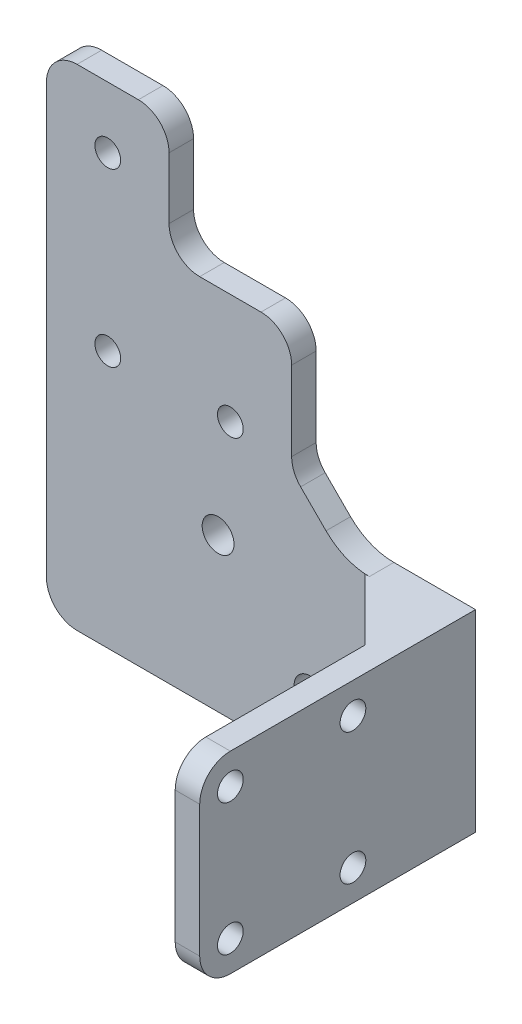
ISO-10303-21;
HEADER;
FILE_DESCRIPTION(('STEP AP214'),'2;1');
FILE_NAME('part.step','',(''),(''),'','','');
FILE_SCHEMA(('AUTOMOTIVE_DESIGN { 1 0 10303 214 1 1 1 1 }'));
ENDSEC;
DATA;
#1=APPLICATION_CONTEXT('core data for automotive mechanical design processes');
#2=APPLICATION_PROTOCOL_DEFINITION('international standard','automotive_design',2000,#1);
#3=PRODUCT_CONTEXT('',#1,'mechanical');
#4=PRODUCT('Part','Part','',(#3));
#5=PRODUCT_RELATED_PRODUCT_CATEGORY('part','',(#4));
#6=PRODUCT_DEFINITION_FORMATION('','',#4);
#7=PRODUCT_DEFINITION_CONTEXT('part definition',#1,'design');
#8=PRODUCT_DEFINITION('design','',#6,#7);
#9=PRODUCT_DEFINITION_SHAPE('','',#8);
#10=(LENGTH_UNIT() NAMED_UNIT(*) SI_UNIT(.MILLI.,.METRE.));
#11=(NAMED_UNIT(*) PLANE_ANGLE_UNIT() SI_UNIT($,.RADIAN.));
#12=(NAMED_UNIT(*) SI_UNIT($,.STERADIAN.) SOLID_ANGLE_UNIT());
#13=UNCERTAINTY_MEASURE_WITH_UNIT(LENGTH_MEASURE(1.E-05),#10,'distance_accuracy_value','');
#14=(GEOMETRIC_REPRESENTATION_CONTEXT(3) GLOBAL_UNCERTAINTY_ASSIGNED_CONTEXT((#13)) GLOBAL_UNIT_ASSIGNED_CONTEXT((#10,
#11,#12)) REPRESENTATION_CONTEXT('',''));
#15=CARTESIAN_POINT('',(0.,0.,0.));
#16=DIRECTION('',(0.,0.,1.));
#17=DIRECTION('',(1.,0.,0.));
#18=AXIS2_PLACEMENT_3D('',#15,#16,#17);
#19=CARTESIAN_POINT('',(303.392668054906,210.464832693422,4.));
#20=DIRECTION('',(0.,0.,1.));
#21=DIRECTION('',(1.,0.,0.));
#22=AXIS2_PLACEMENT_3D('',#19,#20,#21);
#23=PLANE('',#22);
#24=CARTESIAN_POINT('',(268.392738054906,247.464758693422,4.));
#25=DIRECTION('',(0.,0.,1.));
#26=DIRECTION('',(1.,0.,0.));
#27=AXIS2_PLACEMENT_3D('',#24,#25,#26);
#28=CIRCLE('',#27,2.09999579999998);
#29=CARTESIAN_POINT('',(270.492733854906,247.464758693422,4.));
#30=VERTEX_POINT('',#29);
#31=EDGE_CURVE('E311',#30,#30,#28,.T.);
#32=ORIENTED_EDGE('',*,*,#31,.F.);
#33=EDGE_LOOP('',(#32));
#34=FACE_BOUND('',#33,.T.);
#35=CARTESIAN_POINT('',(301.392672054905,215.464822693422,4.));
#36=DIRECTION('',(0.,0.,1.));
#37=DIRECTION('',(1.,0.,0.));
#38=AXIS2_PLACEMENT_3D('',#35,#36,#37);
#39=CIRCLE('',#38,2.59999480000001);
#40=CARTESIAN_POINT('',(303.992666854905,215.464822693422,4.));
#41=VERTEX_POINT('',#40);
#42=EDGE_CURVE('E323',#41,#41,#39,.T.);
#43=ORIENTED_EDGE('',*,*,#42,.F.);
#44=EDGE_LOOP('',(#43));
#45=FACE_BOUND('',#44,.T.);
#46=CARTESIAN_POINT('',(286.392702054905,230.464792693422,4.));
#47=DIRECTION('',(0.,0.,1.));
#48=DIRECTION('',(1.,0.,0.));
#49=AXIS2_PLACEMENT_3D('',#46,#47,#48);
#50=CIRCLE('',#49,2.59999480000001);
#51=CARTESIAN_POINT('',(288.992696854905,230.464792693422,4.));
#52=VERTEX_POINT('',#51);
#53=EDGE_CURVE('E329',#52,#52,#50,.T.);
#54=ORIENTED_EDGE('',*,*,#53,.F.);
#55=EDGE_LOOP('',(#54));
#56=FACE_BOUND('',#55,.T.);
#57=CARTESIAN_POINT('',(268.392738054906,275.464702693422,4.));
#58=DIRECTION('',(0.,0.,1.));
#59=DIRECTION('',(1.,0.,0.));
#60=AXIS2_PLACEMENT_3D('',#57,#58,#59);
#61=CIRCLE('',#60,2.09999579999998);
#62=CARTESIAN_POINT('',(270.492733854906,275.464702693422,4.));
#63=VERTEX_POINT('',#62);
#64=EDGE_CURVE('E317',#63,#63,#61,.T.);
#65=ORIENTED_EDGE('',*,*,#64,.F.);
#66=EDGE_LOOP('',(#65));
#67=FACE_BOUND('',#66,.T.);
#68=CARTESIAN_POINT('',(288.392698054905,247.464758693422,4.));
#69=DIRECTION('',(0.,0.,1.));
#70=DIRECTION('',(1.,0.,0.));
#71=AXIS2_PLACEMENT_3D('',#68,#69,#70);
#72=CIRCLE('',#71,2.09999579999998);
#73=CARTESIAN_POINT('',(290.492693854905,247.464758693422,4.));
#74=VERTEX_POINT('',#73);
#75=EDGE_CURVE('E305',#74,#74,#72,.T.);
#76=ORIENTED_EDGE('',*,*,#75,.F.);
#77=EDGE_LOOP('',(#76));
#78=FACE_BOUND('',#77,.T.);
#79=DIRECTION('',(1.,0.,0.));
#80=VECTOR('',#79,1.);
#81=CARTESIAN_POINT('',(303.392668054906,205.464842693423,4.));
#82=LINE('',#81,#80);
#83=CARTESIAN_POINT('',(263.392748054905,205.464842693422,4.));
#84=VERTEX_POINT('',#83);
#85=CARTESIAN_POINT('',(310.392658054906,205.464842693426,4.));
#86=VERTEX_POINT('',#85);
#87=EDGE_CURVE('E360',#84,#86,#82,.T.);
#88=ORIENTED_EDGE('',*,*,#87,.T.);
#89=DIRECTION('',(0.,-1.,0.));
#90=VECTOR('',#89,1.);
#91=CARTESIAN_POINT('',(310.392658054906,209.464842693426,4.));
#92=LINE('',#91,#90);
#93=CARTESIAN_POINT('',(310.392658054906,209.464842693426,4.));
#94=VERTEX_POINT('',#93);
#95=EDGE_CURVE('E213',#94,#86,#92,.T.);
#96=ORIENTED_EDGE('',*,*,#95,.F.);
#97=DIRECTION('',(-1.,0.,0.));
#98=VECTOR('',#97,1.);
#99=CARTESIAN_POINT('',(320.392658054906,209.464842693426,4.));
#100=LINE('',#99,#98);
#101=CARTESIAN_POINT('',(320.392658054906,209.464842693426,4.));
#102=VERTEX_POINT('',#101);
#103=EDGE_CURVE('E201',#102,#94,#100,.T.);
#104=ORIENTED_EDGE('',*,*,#103,.F.);
#105=DIRECTION('',(0.,-1.,0.));
#106=VECTOR('',#105,1.);
#107=CARTESIAN_POINT('',(320.392658054906,5.65253540686312E-13,4.));
#108=LINE('',#107,#106);
#109=CARTESIAN_POINT('',(320.392658054906,232.929245858551,4.));
#110=VERTEX_POINT('',#109);
#111=EDGE_CURVE('E219',#110,#102,#108,.T.);
#112=ORIENTED_EDGE('',*,*,#111,.F.);
#113=DIRECTION('',(-1.,0.,0.));
#114=VECTOR('',#113,1.);
#115=CARTESIAN_POINT('',(320.392658054906,232.929245858551,4.));
#116=LINE('',#115,#114);
#117=CARTESIAN_POINT('',(310.392658054906,232.929245858551,4.));
#118=VERTEX_POINT('',#117);
#119=EDGE_CURVE('E228',#110,#118,#116,.T.);
#120=ORIENTED_EDGE('',*,*,#119,.T.);
#121=DIRECTION('',(0.,1.,0.));
#122=VECTOR('',#121,1.);
#123=CARTESIAN_POINT('',(310.392658054906,232.929245858551,4.));
#124=LINE('',#123,#122);
#125=CARTESIAN_POINT('',(310.392658054906,236.929245858551,4.));
#126=VERTEX_POINT('',#125);
#127=EDGE_CURVE('E234',#118,#126,#124,.T.);
#128=ORIENTED_EDGE('',*,*,#127,.T.);
#129=DIRECTION('',(-1.,0.,0.));
#130=VECTOR('',#129,1.);
#131=CARTESIAN_POINT('',(320.392658054906,236.929245858551,4.));
#132=LINE('',#131,#130);
#133=CARTESIAN_POINT('',(311.070330513502,236.929245858551,4.));
#134=VERTEX_POINT('',#133);
#135=EDGE_CURVE('E224',#134,#126,#132,.T.);
#136=ORIENTED_EDGE('',*,*,#135,.F.);
#137=CARTESIAN_POINT('',(311.070330513502,246.929245858551,4.));
#138=DIRECTION('',(0.,0.,1.));
#139=DIRECTION('',(1.,0.,0.));
#140=AXIS2_PLACEMENT_3D('',#137,#138,#139);
#141=CIRCLE('',#140,10.);
#142=CARTESIAN_POINT('',(303.999262701636,239.858178046686,4.));
#143=VERTEX_POINT('',#142);
#144=EDGE_CURVE('E11',#134,#143,#141,.F.);
#145=ORIENTED_EDGE('',*,*,#144,.T.);
#146=DIRECTION('',(-0.707106781186549,0.707106781186546,0.));
#147=VECTOR('',#146,1.);
#148=CARTESIAN_POINT('',(299.857141220039,244.000299528283,4.));
#149=LINE('',#148,#147);
#150=CARTESIAN_POINT('',(299.85714122004,244.000299528283,4.));
#151=VERTEX_POINT('',#150);
#152=EDGE_CURVE('E335',#143,#151,#149,.T.);
#153=ORIENTED_EDGE('',*,*,#152,.T.);
#154=CARTESIAN_POINT('',(303.392668054899,247.535826363151,4.));
#155=DIRECTION('',(0.,0.,-1.));
#156=DIRECTION('',(1.,0.,0.));
#157=AXIS2_PLACEMENT_3D('',#154,#155,#156);
#158=CIRCLE('',#157,4.9999899999986);
#159=CARTESIAN_POINT('',(298.392678054901,247.535826363161,4.));
#160=VERTEX_POINT('',#159);
#161=EDGE_CURVE('E337',#151,#160,#158,.T.);
#162=ORIENTED_EDGE('',*,*,#161,.T.);
#163=DIRECTION('',(0.,1.,0.));
#164=VECTOR('',#163,1.);
#165=CARTESIAN_POINT('',(298.392678054901,260.46473269343,4.));
#166=LINE('',#165,#164);
#167=CARTESIAN_POINT('',(298.392678054901,260.46473269343,4.));
#168=VERTEX_POINT('',#167);
#169=EDGE_CURVE('E340',#160,#168,#166,.T.);
#170=ORIENTED_EDGE('',*,*,#169,.T.);
#171=CARTESIAN_POINT('',(293.392688054901,260.464732693422,4.));
#172=DIRECTION('',(0.,0.,1.));
#173=DIRECTION('',(1.,0.,0.));
#174=AXIS2_PLACEMENT_3D('',#171,#172,#173);
#175=CIRCLE('',#174,4.99998999999995);
#176=CARTESIAN_POINT('',(293.392688054901,265.464722693421,4.));
#177=VERTEX_POINT('',#176);
#178=EDGE_CURVE('E342',#168,#177,#175,.T.);
#179=ORIENTED_EDGE('',*,*,#178,.T.);
#180=DIRECTION('',(-1.,0.,0.));
#181=VECTOR('',#180,1.);
#182=CARTESIAN_POINT('',(283.392708054901,265.464722693421,4.));
#183=LINE('',#182,#181);
#184=CARTESIAN_POINT('',(283.392708054901,265.464722693421,4.));
#185=VERTEX_POINT('',#184);
#186=EDGE_CURVE('E344',#177,#185,#183,.T.);
#187=ORIENTED_EDGE('',*,*,#186,.T.);
#188=CARTESIAN_POINT('',(283.392708054901,270.464712693421,4.));
#189=DIRECTION('',(0.,0.,-1.));
#190=DIRECTION('',(1.,0.,0.));
#191=AXIS2_PLACEMENT_3D('',#188,#189,#190);
#192=CIRCLE('',#191,4.9999899999999);
#193=CARTESIAN_POINT('',(278.392718054901,270.464712693421,4.));
#194=VERTEX_POINT('',#193);
#195=EDGE_CURVE('E346',#185,#194,#192,.T.);
#196=ORIENTED_EDGE('',*,*,#195,.T.);
#197=DIRECTION('',(0.,1.,0.));
#198=VECTOR('',#197,1.);
#199=CARTESIAN_POINT('',(278.392718054901,280.464692693422,4.));
#200=LINE('',#199,#198);
#201=CARTESIAN_POINT('',(278.392718054901,280.464692693422,4.));
#202=VERTEX_POINT('',#201);
#203=EDGE_CURVE('E348',#194,#202,#200,.T.);
#204=ORIENTED_EDGE('',*,*,#203,.T.);
#205=CARTESIAN_POINT('',(273.392728054901,280.464692693422,4.));
#206=DIRECTION('',(0.,0.,1.));
#207=DIRECTION('',(1.,0.,0.));
#208=AXIS2_PLACEMENT_3D('',#205,#206,#207);
#209=CIRCLE('',#208,4.99999000000001);
#210=CARTESIAN_POINT('',(273.392728054901,285.464682693422,4.));
#211=VERTEX_POINT('',#210);
#212=EDGE_CURVE('E350',#202,#211,#209,.T.);
#213=ORIENTED_EDGE('',*,*,#212,.T.);
#214=DIRECTION('',(-1.,0.,0.));
#215=VECTOR('',#214,1.);
#216=CARTESIAN_POINT('',(263.392748054902,285.464682693422,4.));
#217=LINE('',#216,#215);
#218=CARTESIAN_POINT('',(263.392748054902,285.464682693422,4.));
#219=VERTEX_POINT('',#218);
#220=EDGE_CURVE('E352',#211,#219,#217,.T.);
#221=ORIENTED_EDGE('',*,*,#220,.T.);
#222=CARTESIAN_POINT('',(263.392748054906,280.464692693422,4.));
#223=DIRECTION('',(0.,0.,1.));
#224=DIRECTION('',(1.,0.,0.));
#225=AXIS2_PLACEMENT_3D('',#222,#223,#224);
#226=CIRCLE('',#225,4.99999000000004);
#227=CARTESIAN_POINT('',(258.392758054906,280.464692693422,4.));
#228=VERTEX_POINT('',#227);
#229=EDGE_CURVE('E354',#219,#228,#226,.T.);
#230=ORIENTED_EDGE('',*,*,#229,.T.);
#231=DIRECTION('',(0.,-1.,0.));
#232=VECTOR('',#231,1.);
#233=CARTESIAN_POINT('',(258.392758054905,210.464832693422,4.));
#234=LINE('',#233,#232);
#235=CARTESIAN_POINT('',(258.392758054905,210.464832693422,4.));
#236=VERTEX_POINT('',#235);
#237=EDGE_CURVE('E356',#228,#236,#234,.T.);
#238=ORIENTED_EDGE('',*,*,#237,.T.);
#239=CARTESIAN_POINT('',(263.392748054905,210.464832693422,4.));
#240=DIRECTION('',(0.,0.,1.));
#241=DIRECTION('',(1.,0.,0.));
#242=AXIS2_PLACEMENT_3D('',#239,#240,#241);
#243=CIRCLE('',#242,4.99999000000007);
#244=EDGE_CURVE('E358',#236,#84,#243,.T.);
#245=ORIENTED_EDGE('',*,*,#244,.T.);
#246=EDGE_LOOP('',(#88,#96,#104,#112,#120,#128,#136,#145,#153,#162,#170,#179,#187,#196,#204,
#213,#221,#230,#238,#245));
#247=FACE_BOUND('',#246,.T.);
#248=ADVANCED_FACE('F37',(#34,#45,#56,#67,#78,#247),#23,.T.);
#249=CARTESIAN_POINT('',(320.392658054906,210.464842693423,40.));
#250=DIRECTION('',(1.,0.,0.));
#251=DIRECTION('',(0.,1.,0.));
#252=AXIS2_PLACEMENT_3D('',#249,#250,#251);
#253=PLANE('',#252);
#254=CARTESIAN_POINT('',(320.392658054906,210.464842693423,20.));
#255=DIRECTION('',(1.,0.,0.));
#256=DIRECTION('',(0.,1.,0.));
#257=AXIS2_PLACEMENT_3D('',#254,#255,#256);
#258=CIRCLE('',#257,2.09999999999999);
#259=CARTESIAN_POINT('',(320.392658054906,212.564842693423,20.));
#260=VERTEX_POINT('',#259);
#261=EDGE_CURVE('E239',#260,#260,#258,.T.);
#262=ORIENTED_EDGE('',*,*,#261,.T.);
#263=EDGE_LOOP('',(#262));
#264=FACE_BOUND('',#263,.T.);
#265=CARTESIAN_POINT('',(320.392658054906,231.929245858551,20.));
#266=DIRECTION('',(1.,0.,0.));
#267=DIRECTION('',(0.,1.,0.));
#268=AXIS2_PLACEMENT_3D('',#265,#266,#267);
#269=CIRCLE('',#268,2.09999999999999);
#270=CARTESIAN_POINT('',(320.392658054906,234.029245858551,20.));
#271=VERTEX_POINT('',#270);
#272=EDGE_CURVE('E245',#271,#271,#269,.T.);
#273=ORIENTED_EDGE('',*,*,#272,.T.);
#274=EDGE_LOOP('',(#273));
#275=FACE_BOUND('',#274,.T.);
#276=CARTESIAN_POINT('',(320.392658054906,210.464842693423,40.));
#277=DIRECTION('',(1.,0.,0.));
#278=DIRECTION('',(0.,1.,0.));
#279=AXIS2_PLACEMENT_3D('',#276,#277,#278);
#280=CIRCLE('',#279,2.09999999999999);
#281=CARTESIAN_POINT('',(320.392658054906,212.564842693423,40.));
#282=VERTEX_POINT('',#281);
#283=EDGE_CURVE('E251',#282,#282,#280,.T.);
#284=ORIENTED_EDGE('',*,*,#283,.T.);
#285=EDGE_LOOP('',(#284));
#286=FACE_BOUND('',#285,.T.);
#287=CARTESIAN_POINT('',(320.392658054906,231.929245858551,40.));
#288=DIRECTION('',(1.,0.,0.));
#289=DIRECTION('',(0.,1.,0.));
#290=AXIS2_PLACEMENT_3D('',#287,#288,#289);
#291=CIRCLE('',#290,2.09999999999999);
#292=CARTESIAN_POINT('',(320.392658054906,234.029245858551,40.));
#293=VERTEX_POINT('',#292);
#294=EDGE_CURVE('E257',#293,#293,#291,.T.);
#295=ORIENTED_EDGE('',*,*,#294,.T.);
#296=EDGE_LOOP('',(#295));
#297=FACE_BOUND('',#296,.T.);
#298=DIRECTION('',(0.,-1.,0.));
#299=VECTOR('',#298,1.);
#300=CARTESIAN_POINT('',(320.392658054906,209.464842693426,14.));
#301=LINE('',#300,#299);
#302=CARTESIAN_POINT('',(320.392658054906,209.464842693426,14.));
#303=VERTEX_POINT('',#302);
#304=CARTESIAN_POINT('',(320.392658054906,205.464842693426,14.));
#305=VERTEX_POINT('',#304);
#306=EDGE_CURVE('E206',#303,#305,#301,.T.);
#307=ORIENTED_EDGE('',*,*,#306,.T.);
#308=DIRECTION('',(0.,0.,-1.));
#309=VECTOR('',#308,1.);
#310=CARTESIAN_POINT('',(320.392658054906,205.464842693423,0.));
#311=LINE('',#310,#309);
#312=CARTESIAN_POINT('',(320.392658054906,205.464842693423,40.));
#313=VERTEX_POINT('',#312);
#314=EDGE_CURVE('E270',#313,#305,#311,.T.);
#315=ORIENTED_EDGE('',*,*,#314,.F.);
#316=CARTESIAN_POINT('',(320.392658054906,210.464842693423,40.));
#317=DIRECTION('',(1.,0.,0.));
#318=DIRECTION('',(0.,1.,0.));
#319=AXIS2_PLACEMENT_3D('',#316,#317,#318);
#320=CIRCLE('',#319,5.);
#321=CARTESIAN_POINT('',(320.392658054906,210.464842693423,45.));
#322=VERTEX_POINT('',#321);
#323=EDGE_CURVE('E287',#322,#313,#320,.T.);
#324=ORIENTED_EDGE('',*,*,#323,.F.);
#325=DIRECTION('',(0.,-1.,0.));
#326=VECTOR('',#325,1.);
#327=CARTESIAN_POINT('',(320.392658054906,231.929245858551,45.));
#328=LINE('',#327,#326);
#329=CARTESIAN_POINT('',(320.392658054906,231.929245858551,45.));
#330=VERTEX_POINT('',#329);
#331=EDGE_CURVE('E285',#330,#322,#328,.T.);
#332=ORIENTED_EDGE('',*,*,#331,.F.);
#333=CARTESIAN_POINT('',(320.392658054906,231.929245858551,40.));
#334=DIRECTION('',(1.,0.,0.));
#335=DIRECTION('',(0.,-1.,0.));
#336=AXIS2_PLACEMENT_3D('',#333,#334,#335);
#337=CIRCLE('',#336,5.);
#338=CARTESIAN_POINT('',(320.392658054906,236.929245858551,40.));
#339=VERTEX_POINT('',#338);
#340=EDGE_CURVE('E283',#339,#330,#337,.T.);
#341=ORIENTED_EDGE('',*,*,#340,.F.);
#342=DIRECTION('',(0.,0.,1.));
#343=VECTOR('',#342,1.);
#344=CARTESIAN_POINT('',(320.392658054906,236.929245858551,0.));
#345=LINE('',#344,#343);
#346=CARTESIAN_POINT('',(320.392658054906,236.929245858551,14.));
#347=VERTEX_POINT('',#346);
#348=EDGE_CURVE('E263',#347,#339,#345,.T.);
#349=ORIENTED_EDGE('',*,*,#348,.F.);
#350=DIRECTION('',(0.,1.,0.));
#351=VECTOR('',#350,1.);
#352=CARTESIAN_POINT('',(320.392658054906,232.929245858551,14.));
#353=LINE('',#352,#351);
#354=CARTESIAN_POINT('',(320.392658054906,232.929245858551,14.));
#355=VERTEX_POINT('',#354);
#356=EDGE_CURVE('E237',#355,#347,#353,.T.);
#357=ORIENTED_EDGE('',*,*,#356,.F.);
#358=DIRECTION('',(0.,0.,-1.));
#359=VECTOR('',#358,1.);
#360=CARTESIAN_POINT('',(320.392658054906,232.929245858551,14.));
#361=LINE('',#360,#359);
#362=EDGE_CURVE('E226',#355,#110,#361,.T.);
#363=ORIENTED_EDGE('',*,*,#362,.T.);
#364=ORIENTED_EDGE('',*,*,#111,.T.);
#365=DIRECTION('',(0.,0.,-1.));
#366=VECTOR('',#365,1.);
#367=CARTESIAN_POINT('',(320.392658054906,209.464842693426,14.));
#368=LINE('',#367,#366);
#369=EDGE_CURVE('E199',#303,#102,#368,.T.);
#370=ORIENTED_EDGE('',*,*,#369,.F.);
#371=EDGE_LOOP('',(#307,#315,#324,#332,#341,#349,#357,#363,#364,#370));
#372=FACE_BOUND('',#371,.T.);
#373=ADVANCED_FACE('F216',(#264,#275,#286,#297,#372),#253,.F.);
#374=CARTESIAN_POINT('',(303.392668054906,210.464832693422,0.));
#375=DIRECTION('',(0.,0.,1.));
#376=DIRECTION('',(1.,0.,0.));
#377=AXIS2_PLACEMENT_3D('',#374,#375,#376);
#378=PLANE('',#377);
#379=DIRECTION('',(-1.,0.,0.));
#380=VECTOR('',#379,1.);
#381=CARTESIAN_POINT('',(0.,236.929245858551,0.));
#382=LINE('',#381,#380);
#383=CARTESIAN_POINT('',(324.392658054906,236.929245858551,0.));
#384=VERTEX_POINT('',#383);
#385=CARTESIAN_POINT('',(311.070330513502,236.929245858551,0.));
#386=VERTEX_POINT('',#385);
#387=EDGE_CURVE('E301',#384,#386,#382,.T.);
#388=ORIENTED_EDGE('',*,*,#387,.F.);
#389=DIRECTION('',(0.,1.,0.));
#390=VECTOR('',#389,1.);
#391=CARTESIAN_POINT('',(324.392658054906,236.929245858551,0.));
#392=LINE('',#391,#390);
#393=CARTESIAN_POINT('',(324.392658054906,205.464842693423,0.));
#394=VERTEX_POINT('',#393);
#395=EDGE_CURVE('E266',#394,#384,#392,.T.);
#396=ORIENTED_EDGE('',*,*,#395,.F.);
#397=DIRECTION('',(1.,0.,0.));
#398=VECTOR('',#397,1.);
#399=CARTESIAN_POINT('',(303.392668054906,205.464842693423,0.));
#400=LINE('',#399,#398);
#401=CARTESIAN_POINT('',(263.392748054905,205.464842693422,0.));
#402=VERTEX_POINT('',#401);
#403=EDGE_CURVE('E338',#402,#394,#400,.T.);
#404=ORIENTED_EDGE('',*,*,#403,.F.);
#405=CARTESIAN_POINT('',(263.392748054905,210.464832693422,0.));
#406=DIRECTION('',(0.,0.,1.));
#407=DIRECTION('',(1.,0.,0.));
#408=AXIS2_PLACEMENT_3D('',#405,#406,#407);
#409=CIRCLE('',#408,4.99999000000007);
#410=CARTESIAN_POINT('',(258.392758054905,210.464832693422,0.));
#411=VERTEX_POINT('',#410);
#412=EDGE_CURVE('E385',#411,#402,#409,.T.);
#413=ORIENTED_EDGE('',*,*,#412,.F.);
#414=DIRECTION('',(0.,-1.,0.));
#415=VECTOR('',#414,1.);
#416=CARTESIAN_POINT('',(258.392758054905,210.464832693422,0.));
#417=LINE('',#416,#415);
#418=CARTESIAN_POINT('',(258.392758054906,280.464692693422,0.));
#419=VERTEX_POINT('',#418);
#420=EDGE_CURVE('E383',#419,#411,#417,.T.);
#421=ORIENTED_EDGE('',*,*,#420,.F.);
#422=CARTESIAN_POINT('',(263.392748054906,280.464692693422,0.));
#423=DIRECTION('',(0.,0.,1.));
#424=DIRECTION('',(1.,0.,0.));
#425=AXIS2_PLACEMENT_3D('',#422,#423,#424);
#426=CIRCLE('',#425,4.99999000000004);
#427=CARTESIAN_POINT('',(263.392748054902,285.464682693422,0.));
#428=VERTEX_POINT('',#427);
#429=EDGE_CURVE('E381',#428,#419,#426,.T.);
#430=ORIENTED_EDGE('',*,*,#429,.F.);
#431=DIRECTION('',(-1.,0.,0.));
#432=VECTOR('',#431,1.);
#433=CARTESIAN_POINT('',(263.392748054902,285.464682693422,0.));
#434=LINE('',#433,#432);
#435=CARTESIAN_POINT('',(273.392728054901,285.464682693422,0.));
#436=VERTEX_POINT('',#435);
#437=EDGE_CURVE('E379',#436,#428,#434,.T.);
#438=ORIENTED_EDGE('',*,*,#437,.F.);
#439=CARTESIAN_POINT('',(273.392728054901,280.464692693422,0.));
#440=DIRECTION('',(0.,0.,1.));
#441=DIRECTION('',(1.,0.,0.));
#442=AXIS2_PLACEMENT_3D('',#439,#440,#441);
#443=CIRCLE('',#442,4.99999000000001);
#444=CARTESIAN_POINT('',(278.392718054901,280.464692693422,0.));
#445=VERTEX_POINT('',#444);
#446=EDGE_CURVE('E377',#445,#436,#443,.T.);
#447=ORIENTED_EDGE('',*,*,#446,.F.);
#448=DIRECTION('',(0.,1.,0.));
#449=VECTOR('',#448,1.);
#450=CARTESIAN_POINT('',(278.392718054901,280.464692693422,0.));
#451=LINE('',#450,#449);
#452=CARTESIAN_POINT('',(278.392718054901,270.464712693421,0.));
#453=VERTEX_POINT('',#452);
#454=EDGE_CURVE('E375',#453,#445,#451,.T.);
#455=ORIENTED_EDGE('',*,*,#454,.F.);
#456=CARTESIAN_POINT('',(283.392708054901,270.464712693421,0.));
#457=DIRECTION('',(0.,0.,-1.));
#458=DIRECTION('',(1.,0.,0.));
#459=AXIS2_PLACEMENT_3D('',#456,#457,#458);
#460=CIRCLE('',#459,4.9999899999999);
#461=CARTESIAN_POINT('',(283.392708054901,265.464722693421,0.));
#462=VERTEX_POINT('',#461);
#463=EDGE_CURVE('E373',#462,#453,#460,.T.);
#464=ORIENTED_EDGE('',*,*,#463,.F.);
#465=DIRECTION('',(-1.,0.,0.));
#466=VECTOR('',#465,1.);
#467=CARTESIAN_POINT('',(283.392708054901,265.464722693421,0.));
#468=LINE('',#467,#466);
#469=CARTESIAN_POINT('',(293.392688054901,265.464722693421,0.));
#470=VERTEX_POINT('',#469);
#471=EDGE_CURVE('E371',#470,#462,#468,.T.);
#472=ORIENTED_EDGE('',*,*,#471,.F.);
#473=CARTESIAN_POINT('',(293.392688054901,260.464732693422,0.));
#474=DIRECTION('',(0.,0.,1.));
#475=DIRECTION('',(1.,0.,0.));
#476=AXIS2_PLACEMENT_3D('',#473,#474,#475);
#477=CIRCLE('',#476,4.99998999999995);
#478=CARTESIAN_POINT('',(298.392678054901,260.46473269343,0.));
#479=VERTEX_POINT('',#478);
#480=EDGE_CURVE('E369',#479,#470,#477,.T.);
#481=ORIENTED_EDGE('',*,*,#480,.F.);
#482=DIRECTION('',(0.,1.,0.));
#483=VECTOR('',#482,1.);
#484=CARTESIAN_POINT('',(298.392678054901,260.46473269343,0.));
#485=LINE('',#484,#483);
#486=CARTESIAN_POINT('',(298.392678054901,247.535826363161,0.));
#487=VERTEX_POINT('',#486);
#488=EDGE_CURVE('E367',#487,#479,#485,.T.);
#489=ORIENTED_EDGE('',*,*,#488,.F.);
#490=CARTESIAN_POINT('',(303.392668054899,247.535826363151,0.));
#491=DIRECTION('',(0.,0.,-1.));
#492=DIRECTION('',(1.,0.,0.));
#493=AXIS2_PLACEMENT_3D('',#490,#491,#492);
#494=CIRCLE('',#493,4.9999899999986);
#495=CARTESIAN_POINT('',(299.85714122004,244.000299528283,0.));
#496=VERTEX_POINT('',#495);
#497=EDGE_CURVE('E365',#496,#487,#494,.T.);
#498=ORIENTED_EDGE('',*,*,#497,.F.);
#499=DIRECTION('',(-0.707106781186549,0.707106781186546,0.));
#500=VECTOR('',#499,1.);
#501=CARTESIAN_POINT('',(299.857141220039,244.000299528283,0.));
#502=LINE('',#501,#500);
#503=CARTESIAN_POINT('',(303.999262701636,239.858178046686,0.));
#504=VERTEX_POINT('',#503);
#505=EDGE_CURVE('E332',#504,#496,#502,.T.);
#506=ORIENTED_EDGE('',*,*,#505,.F.);
#507=CARTESIAN_POINT('',(311.070330513502,246.929245858551,0.));
#508=DIRECTION('',(0.,0.,1.));
#509=DIRECTION('',(1.,0.,0.));
#510=AXIS2_PLACEMENT_3D('',#507,#508,#509);
#511=CIRCLE('',#510,10.);
#512=EDGE_CURVE('E45',#504,#386,#511,.T.);
#513=ORIENTED_EDGE('',*,*,#512,.T.);
#514=EDGE_LOOP('',(#388,#396,#404,#413,#421,#430,#438,#447,#455,#464,#472,#481,#489,#498,#506,#513));
#515=FACE_BOUND('',#514,.T.);
#516=CARTESIAN_POINT('',(286.392702054905,230.464792693422,0.));
#517=DIRECTION('',(0.,0.,1.));
#518=DIRECTION('',(1.,0.,0.));
#519=AXIS2_PLACEMENT_3D('',#516,#517,#518);
#520=CIRCLE('',#519,2.59999480000001);
#521=CARTESIAN_POINT('',(288.992696854905,230.464792693422,0.));
#522=VERTEX_POINT('',#521);
#523=EDGE_CURVE('E326',#522,#522,#520,.T.);
#524=ORIENTED_EDGE('',*,*,#523,.T.);
#525=EDGE_LOOP('',(#524));
#526=FACE_BOUND('',#525,.T.);
#527=CARTESIAN_POINT('',(301.392672054905,215.464822693422,0.));
#528=DIRECTION('',(0.,0.,1.));
#529=DIRECTION('',(1.,0.,0.));
#530=AXIS2_PLACEMENT_3D('',#527,#528,#529);
#531=CIRCLE('',#530,2.59999480000001);
#532=CARTESIAN_POINT('',(303.992666854905,215.464822693422,0.));
#533=VERTEX_POINT('',#532);
#534=EDGE_CURVE('E320',#533,#533,#531,.T.);
#535=ORIENTED_EDGE('',*,*,#534,.T.);
#536=EDGE_LOOP('',(#535));
#537=FACE_BOUND('',#536,.T.);
#538=CARTESIAN_POINT('',(268.392738054906,275.464702693422,0.));
#539=DIRECTION('',(0.,0.,1.));
#540=DIRECTION('',(1.,0.,0.));
#541=AXIS2_PLACEMENT_3D('',#538,#539,#540);
#542=CIRCLE('',#541,2.09999579999998);
#543=CARTESIAN_POINT('',(270.492733854906,275.464702693422,0.));
#544=VERTEX_POINT('',#543);
#545=EDGE_CURVE('E314',#544,#544,#542,.T.);
#546=ORIENTED_EDGE('',*,*,#545,.T.);
#547=EDGE_LOOP('',(#546));
#548=FACE_BOUND('',#547,.T.);
#549=CARTESIAN_POINT('',(268.392738054906,247.464758693422,0.));
#550=DIRECTION('',(0.,0.,1.));
#551=DIRECTION('',(1.,0.,0.));
#552=AXIS2_PLACEMENT_3D('',#549,#550,#551);
#553=CIRCLE('',#552,2.09999579999998);
#554=CARTESIAN_POINT('',(270.492733854906,247.464758693422,0.));
#555=VERTEX_POINT('',#554);
#556=EDGE_CURVE('E308',#555,#555,#553,.T.);
#557=ORIENTED_EDGE('',*,*,#556,.T.);
#558=EDGE_LOOP('',(#557));
#559=FACE_BOUND('',#558,.T.);
#560=CARTESIAN_POINT('',(288.392698054905,247.464758693422,0.));
#561=DIRECTION('',(0.,0.,1.));
#562=DIRECTION('',(1.,0.,0.));
#563=AXIS2_PLACEMENT_3D('',#560,#561,#562);
#564=CIRCLE('',#563,2.09999579999998);
#565=CARTESIAN_POINT('',(290.492693854905,247.464758693422,0.));
#566=VERTEX_POINT('',#565);
#567=EDGE_CURVE('E303',#566,#566,#564,.T.);
#568=ORIENTED_EDGE('',*,*,#567,.T.);
#569=EDGE_LOOP('',(#568));
#570=FACE_BOUND('',#569,.T.);
#571=ADVANCED_FACE('F521',(#515,#526,#537,#548,#559,#570),#378,.F.);
#572=CARTESIAN_POINT('',(299.857141220039,244.000299528283,4.));
#573=DIRECTION('',(-0.707106781186546,-0.707106781186549,0.));
#574=DIRECTION('',(0.707106781186549,-0.707106781186546,0.));
#575=AXIS2_PLACEMENT_3D('',#572,#573,#574);
#576=PLANE('',#575);
#577=ORIENTED_EDGE('',*,*,#152,.F.);
#578=DIRECTION('',(0.,0.,-1.));
#579=VECTOR('',#578,1.);
#580=CARTESIAN_POINT('',(303.999262701636,239.858178046686,0.));
#581=LINE('',#580,#579);
#582=EDGE_CURVE('E423',#143,#504,#581,.T.);
#583=ORIENTED_EDGE('',*,*,#582,.T.);
#584=ORIENTED_EDGE('',*,*,#505,.T.);
#585=DIRECTION('',(0.,0.,-1.));
#586=VECTOR('',#585,1.);
#587=CARTESIAN_POINT('',(299.85714122004,244.000299528283,4.));
#588=LINE('',#587,#586);
#589=EDGE_CURVE('E420',#151,#496,#588,.T.);
#590=ORIENTED_EDGE('',*,*,#589,.F.);
#591=EDGE_LOOP('',(#577,#583,#584,#590));
#592=FACE_BOUND('',#591,.T.);
#593=ADVANCED_FACE('F438',(#592),#576,.F.);
#594=CARTESIAN_POINT('',(303.392668054899,247.535826363151,4.));
#595=DIRECTION('',(0.,0.,-1.));
#596=DIRECTION('',(-1.,0.,0.));
#597=AXIS2_PLACEMENT_3D('',#594,#595,#596);
#598=CYLINDRICAL_SURFACE('',#597,4.9999899999986);
#599=ORIENTED_EDGE('',*,*,#497,.T.);
#600=DIRECTION('',(0.,0.,-1.));
#601=VECTOR('',#600,1.);
#602=CARTESIAN_POINT('',(298.392678054901,247.535826363161,4.));
#603=LINE('',#602,#601);
#604=EDGE_CURVE('E417',#160,#487,#603,.T.);
#605=ORIENTED_EDGE('',*,*,#604,.F.);
#606=ORIENTED_EDGE('',*,*,#161,.F.);
#607=ORIENTED_EDGE('',*,*,#589,.T.);
#608=EDGE_LOOP('',(#599,#605,#606,#607));
#609=FACE_BOUND('',#608,.T.);
#610=ADVANCED_FACE('F443',(#609),#598,.F.);
#611=CARTESIAN_POINT('',(298.392678054901,260.46473269343,4.));
#612=DIRECTION('',(-1.,0.,0.));
#613=DIRECTION('',(0.,0.,1.));
#614=AXIS2_PLACEMENT_3D('',#611,#612,#613);
#615=PLANE('',#614);
#616=ORIENTED_EDGE('',*,*,#488,.T.);
#617=DIRECTION('',(0.,0.,-1.));
#618=VECTOR('',#617,1.);
#619=CARTESIAN_POINT('',(298.392678054901,260.46473269343,4.));
#620=LINE('',#619,#618);
#621=EDGE_CURVE('E414',#168,#479,#620,.T.);
#622=ORIENTED_EDGE('',*,*,#621,.F.);
#623=ORIENTED_EDGE('',*,*,#169,.F.);
#624=ORIENTED_EDGE('',*,*,#604,.T.);
#625=EDGE_LOOP('',(#616,#622,#623,#624));
#626=FACE_BOUND('',#625,.T.);
#627=ADVANCED_FACE('F449',(#626),#615,.F.);
#628=CARTESIAN_POINT('',(293.392688054901,260.464732693422,4.));
#629=DIRECTION('',(0.,0.,-1.));
#630=DIRECTION('',(-1.,0.,0.));
#631=AXIS2_PLACEMENT_3D('',#628,#629,#630);
#632=CYLINDRICAL_SURFACE('',#631,4.99998999999995);
#633=ORIENTED_EDGE('',*,*,#480,.T.);
#634=DIRECTION('',(0.,0.,-1.));
#635=VECTOR('',#634,1.);
#636=CARTESIAN_POINT('',(293.392688054901,265.464722693421,4.));
#637=LINE('',#636,#635);
#638=EDGE_CURVE('E411',#177,#470,#637,.T.);
#639=ORIENTED_EDGE('',*,*,#638,.F.);
#640=ORIENTED_EDGE('',*,*,#178,.F.);
#641=ORIENTED_EDGE('',*,*,#621,.T.);
#642=EDGE_LOOP('',(#633,#639,#640,#641));
#643=FACE_BOUND('',#642,.T.);
#644=ADVANCED_FACE('F453',(#643),#632,.T.);
#645=CARTESIAN_POINT('',(283.392708054901,265.464722693421,4.));
#646=DIRECTION('',(0.,-1.,0.));
#647=DIRECTION('',(0.,0.,-1.));
#648=AXIS2_PLACEMENT_3D('',#645,#646,#647);
#649=PLANE('',#648);
#650=ORIENTED_EDGE('',*,*,#471,.T.);
#651=DIRECTION('',(0.,0.,-1.));
#652=VECTOR('',#651,1.);
#653=CARTESIAN_POINT('',(283.392708054901,265.464722693421,4.));
#654=LINE('',#653,#652);
#655=EDGE_CURVE('E408',#185,#462,#654,.T.);
#656=ORIENTED_EDGE('',*,*,#655,.F.);
#657=ORIENTED_EDGE('',*,*,#186,.F.);
#658=ORIENTED_EDGE('',*,*,#638,.T.);
#659=EDGE_LOOP('',(#650,#656,#657,#658));
#660=FACE_BOUND('',#659,.T.);
#661=ADVANCED_FACE('F458',(#660),#649,.F.);
#662=CARTESIAN_POINT('',(283.392708054901,270.464712693421,4.));
#663=DIRECTION('',(0.,0.,-1.));
#664=DIRECTION('',(-1.,0.,0.));
#665=AXIS2_PLACEMENT_3D('',#662,#663,#664);
#666=CYLINDRICAL_SURFACE('',#665,4.9999899999999);
#667=ORIENTED_EDGE('',*,*,#463,.T.);
#668=DIRECTION('',(0.,0.,-1.));
#669=VECTOR('',#668,1.);
#670=CARTESIAN_POINT('',(278.392718054901,270.464712693421,4.));
#671=LINE('',#670,#669);
#672=EDGE_CURVE('E405',#194,#453,#671,.T.);
#673=ORIENTED_EDGE('',*,*,#672,.F.);
#674=ORIENTED_EDGE('',*,*,#195,.F.);
#675=ORIENTED_EDGE('',*,*,#655,.T.);
#676=EDGE_LOOP('',(#667,#673,#674,#675));
#677=FACE_BOUND('',#676,.T.);
#678=ADVANCED_FACE('F464',(#677),#666,.F.);
#679=CARTESIAN_POINT('',(278.392718054901,280.464692693422,4.));
#680=DIRECTION('',(-1.,0.,0.));
#681=DIRECTION('',(0.,0.,1.));
#682=AXIS2_PLACEMENT_3D('',#679,#680,#681);
#683=PLANE('',#682);
#684=ORIENTED_EDGE('',*,*,#454,.T.);
#685=DIRECTION('',(0.,0.,-1.));
#686=VECTOR('',#685,1.);
#687=CARTESIAN_POINT('',(278.392718054901,280.464692693422,4.));
#688=LINE('',#687,#686);
#689=EDGE_CURVE('E402',#202,#445,#688,.T.);
#690=ORIENTED_EDGE('',*,*,#689,.F.);
#691=ORIENTED_EDGE('',*,*,#203,.F.);
#692=ORIENTED_EDGE('',*,*,#672,.T.);
#693=EDGE_LOOP('',(#684,#690,#691,#692));
#694=FACE_BOUND('',#693,.T.);
#695=ADVANCED_FACE('F468',(#694),#683,.F.);
#696=CARTESIAN_POINT('',(273.392728054901,280.464692693422,4.));
#697=DIRECTION('',(0.,0.,-1.));
#698=DIRECTION('',(-1.,0.,0.));
#699=AXIS2_PLACEMENT_3D('',#696,#697,#698);
#700=CYLINDRICAL_SURFACE('',#699,4.99999000000001);
#701=ORIENTED_EDGE('',*,*,#446,.T.);
#702=DIRECTION('',(0.,0.,-1.));
#703=VECTOR('',#702,1.);
#704=CARTESIAN_POINT('',(273.392728054901,285.464682693422,4.));
#705=LINE('',#704,#703);
#706=EDGE_CURVE('E399',#211,#436,#705,.T.);
#707=ORIENTED_EDGE('',*,*,#706,.F.);
#708=ORIENTED_EDGE('',*,*,#212,.F.);
#709=ORIENTED_EDGE('',*,*,#689,.T.);
#710=EDGE_LOOP('',(#701,#707,#708,#709));
#711=FACE_BOUND('',#710,.T.);
#712=ADVANCED_FACE('F473',(#711),#700,.T.);
#713=CARTESIAN_POINT('',(263.392748054902,285.464682693422,4.));
#714=DIRECTION('',(0.,-1.,0.));
#715=DIRECTION('',(0.,0.,-1.));
#716=AXIS2_PLACEMENT_3D('',#713,#714,#715);
#717=PLANE('',#716);
#718=ORIENTED_EDGE('',*,*,#437,.T.);
#719=DIRECTION('',(0.,0.,-1.));
#720=VECTOR('',#719,1.);
#721=CARTESIAN_POINT('',(263.392748054902,285.464682693422,4.));
#722=LINE('',#721,#720);
#723=EDGE_CURVE('E396',#219,#428,#722,.T.);
#724=ORIENTED_EDGE('',*,*,#723,.F.);
#725=ORIENTED_EDGE('',*,*,#220,.F.);
#726=ORIENTED_EDGE('',*,*,#706,.T.);
#727=EDGE_LOOP('',(#718,#724,#725,#726));
#728=FACE_BOUND('',#727,.T.);
#729=ADVANCED_FACE('F479',(#728),#717,.F.);
#730=CARTESIAN_POINT('',(263.392748054906,280.464692693422,4.));
#731=DIRECTION('',(0.,0.,-1.));
#732=DIRECTION('',(-1.,0.,0.));
#733=AXIS2_PLACEMENT_3D('',#730,#731,#732);
#734=CYLINDRICAL_SURFACE('',#733,4.99999000000004);
#735=ORIENTED_EDGE('',*,*,#429,.T.);
#736=DIRECTION('',(0.,0.,-1.));
#737=VECTOR('',#736,1.);
#738=CARTESIAN_POINT('',(258.392758054906,280.464692693422,4.));
#739=LINE('',#738,#737);
#740=EDGE_CURVE('E393',#228,#419,#739,.T.);
#741=ORIENTED_EDGE('',*,*,#740,.F.);
#742=ORIENTED_EDGE('',*,*,#229,.F.);
#743=ORIENTED_EDGE('',*,*,#723,.T.);
#744=EDGE_LOOP('',(#735,#741,#742,#743));
#745=FACE_BOUND('',#744,.T.);
#746=ADVANCED_FACE('F483',(#745),#734,.T.);
#747=CARTESIAN_POINT('',(258.392758054905,210.464832693422,4.));
#748=DIRECTION('',(1.,0.,0.));
#749=DIRECTION('',(0.,1.,0.));
#750=AXIS2_PLACEMENT_3D('',#747,#748,#749);
#751=PLANE('',#750);
#752=ORIENTED_EDGE('',*,*,#420,.T.);
#753=DIRECTION('',(0.,0.,-1.));
#754=VECTOR('',#753,1.);
#755=CARTESIAN_POINT('',(258.392758054905,210.464832693422,4.));
#756=LINE('',#755,#754);
#757=EDGE_CURVE('E390',#236,#411,#756,.T.);
#758=ORIENTED_EDGE('',*,*,#757,.F.);
#759=ORIENTED_EDGE('',*,*,#237,.F.);
#760=ORIENTED_EDGE('',*,*,#740,.T.);
#761=EDGE_LOOP('',(#752,#758,#759,#760));
#762=FACE_BOUND('',#761,.T.);
#763=ADVANCED_FACE('F488',(#762),#751,.F.);
#764=CARTESIAN_POINT('',(263.392748054905,210.464832693422,4.));
#765=DIRECTION('',(0.,0.,-1.));
#766=DIRECTION('',(-1.,0.,0.));
#767=AXIS2_PLACEMENT_3D('',#764,#765,#766);
#768=CYLINDRICAL_SURFACE('',#767,4.99999000000007);
#769=ORIENTED_EDGE('',*,*,#412,.T.);
#770=DIRECTION('',(0.,0.,-1.));
#771=VECTOR('',#770,1.);
#772=CARTESIAN_POINT('',(263.392748054905,205.464842693422,4.));
#773=LINE('',#772,#771);
#774=EDGE_CURVE('E363',#84,#402,#773,.T.);
#775=ORIENTED_EDGE('',*,*,#774,.F.);
#776=ORIENTED_EDGE('',*,*,#244,.F.);
#777=ORIENTED_EDGE('',*,*,#757,.T.);
#778=EDGE_LOOP('',(#769,#775,#776,#777));
#779=FACE_BOUND('',#778,.T.);
#780=ADVANCED_FACE('F493',(#779),#768,.T.);
#781=CARTESIAN_POINT('',(303.392668054906,205.464842693423,4.));
#782=DIRECTION('',(0.,1.,0.));
#783=DIRECTION('',(-1.,0.,0.));
#784=AXIS2_PLACEMENT_3D('',#781,#782,#783);
#785=PLANE('',#784);
#786=DIRECTION('',(0.707106781186548,0.,0.707106781186547));
#787=VECTOR('',#786,1.);
#788=CARTESIAN_POINT('',(310.392658054906,205.464842693426,4.));
#789=LINE('',#788,#787);
#790=EDGE_CURVE('E209',#86,#305,#789,.T.);
#791=ORIENTED_EDGE('',*,*,#790,.F.);
#792=ORIENTED_EDGE('',*,*,#87,.F.);
#793=ORIENTED_EDGE('',*,*,#774,.T.);
#794=ORIENTED_EDGE('',*,*,#403,.T.);
#795=DIRECTION('',(0.,0.,-1.));
#796=VECTOR('',#795,1.);
#797=CARTESIAN_POINT('',(324.392658054906,205.464842693423,0.));
#798=LINE('',#797,#796);
#799=CARTESIAN_POINT('',(324.392658054906,205.464842693423,40.));
#800=VERTEX_POINT('',#799);
#801=EDGE_CURVE('E278',#800,#394,#798,.T.);
#802=ORIENTED_EDGE('',*,*,#801,.F.);
#803=DIRECTION('',(-1.,0.,0.));
#804=VECTOR('',#803,1.);
#805=CARTESIAN_POINT('',(324.392658054906,205.464842693423,40.));
#806=LINE('',#805,#804);
#807=EDGE_CURVE('E281',#800,#313,#806,.T.);
#808=ORIENTED_EDGE('',*,*,#807,.T.);
#809=ORIENTED_EDGE('',*,*,#314,.T.);
#810=EDGE_LOOP('',(#791,#792,#793,#794,#802,#808,#809));
#811=FACE_BOUND('',#810,.T.);
#812=ADVANCED_FACE('F497',(#811),#785,.F.);
#813=CARTESIAN_POINT('',(286.392702054905,230.464792693422,4.));
#814=DIRECTION('',(0.,0.,-1.));
#815=DIRECTION('',(-1.,0.,0.));
#816=AXIS2_PLACEMENT_3D('',#813,#814,#815);
#817=CYLINDRICAL_SURFACE('',#816,2.59999480000001);
#818=ORIENTED_EDGE('',*,*,#53,.T.);
#819=EDGE_LOOP('',(#818));
#820=FACE_BOUND('',#819,.T.);
#821=ORIENTED_EDGE('',*,*,#523,.F.);
#822=EDGE_LOOP('',(#821));
#823=FACE_BOUND('',#822,.T.);
#824=ADVANCED_FACE('F561',(#820,#823),#817,.F.);
#825=CARTESIAN_POINT('',(301.392672054905,215.464822693422,4.));
#826=DIRECTION('',(0.,0.,-1.));
#827=DIRECTION('',(-1.,0.,0.));
#828=AXIS2_PLACEMENT_3D('',#825,#826,#827);
#829=CYLINDRICAL_SURFACE('',#828,2.59999480000001);
#830=ORIENTED_EDGE('',*,*,#42,.T.);
#831=EDGE_LOOP('',(#830));
#832=FACE_BOUND('',#831,.T.);
#833=ORIENTED_EDGE('',*,*,#534,.F.);
#834=EDGE_LOOP('',(#833));
#835=FACE_BOUND('',#834,.T.);
#836=ADVANCED_FACE('F781',(#832,#835),#829,.F.);
#837=CARTESIAN_POINT('',(268.392738054906,275.464702693422,4.));
#838=DIRECTION('',(0.,0.,-1.));
#839=DIRECTION('',(-1.,0.,0.));
#840=AXIS2_PLACEMENT_3D('',#837,#838,#839);
#841=CYLINDRICAL_SURFACE('',#840,2.09999579999998);
#842=ORIENTED_EDGE('',*,*,#64,.T.);
#843=EDGE_LOOP('',(#842));
#844=FACE_BOUND('',#843,.T.);
#845=ORIENTED_EDGE('',*,*,#545,.F.);
#846=EDGE_LOOP('',(#845));
#847=FACE_BOUND('',#846,.T.);
#848=ADVANCED_FACE('F546',(#844,#847),#841,.F.);
#849=CARTESIAN_POINT('',(268.392738054906,247.464758693422,4.));
#850=DIRECTION('',(0.,0.,-1.));
#851=DIRECTION('',(-1.,0.,0.));
#852=AXIS2_PLACEMENT_3D('',#849,#850,#851);
#853=CYLINDRICAL_SURFACE('',#852,2.09999579999998);
#854=ORIENTED_EDGE('',*,*,#31,.T.);
#855=EDGE_LOOP('',(#854));
#856=FACE_BOUND('',#855,.T.);
#857=ORIENTED_EDGE('',*,*,#556,.F.);
#858=EDGE_LOOP('',(#857));
#859=FACE_BOUND('',#858,.T.);
#860=ADVANCED_FACE('F537',(#856,#859),#853,.F.);
#861=CARTESIAN_POINT('',(288.392698054905,247.464758693422,4.));
#862=DIRECTION('',(0.,0.,-1.));
#863=DIRECTION('',(-1.,0.,0.));
#864=AXIS2_PLACEMENT_3D('',#861,#862,#863);
#865=CYLINDRICAL_SURFACE('',#864,2.09999579999998);
#866=ORIENTED_EDGE('',*,*,#75,.T.);
#867=EDGE_LOOP('',(#866));
#868=FACE_BOUND('',#867,.T.);
#869=ORIENTED_EDGE('',*,*,#567,.F.);
#870=EDGE_LOOP('',(#869));
#871=FACE_BOUND('',#870,.T.);
#872=ADVANCED_FACE('F535',(#868,#871),#865,.F.);
#873=CARTESIAN_POINT('',(0.,236.929245858551,4.));
#874=DIRECTION('',(0.,-1.,0.));
#875=DIRECTION('',(0.,0.,-1.));
#876=AXIS2_PLACEMENT_3D('',#873,#874,#875);
#877=PLANE('',#876);
#878=DIRECTION('',(0.,0.,-1.));
#879=VECTOR('',#878,1.);
#880=CARTESIAN_POINT('',(311.070330513502,236.929245858551,4.));
#881=LINE('',#880,#879);
#882=EDGE_CURVE('E426',#386,#134,#881,.F.);
#883=ORIENTED_EDGE('',*,*,#882,.T.);
#884=ORIENTED_EDGE('',*,*,#135,.T.);
#885=DIRECTION('',(0.707106781186548,0.,0.707106781186547));
#886=VECTOR('',#885,1.);
#887=CARTESIAN_POINT('',(310.392658054906,236.929245858551,4.));
#888=LINE('',#887,#886);
#889=EDGE_CURVE('E52',#126,#347,#888,.T.);
#890=ORIENTED_EDGE('',*,*,#889,.T.);
#891=ORIENTED_EDGE('',*,*,#348,.T.);
#892=DIRECTION('',(-1.,0.,0.));
#893=VECTOR('',#892,1.);
#894=CARTESIAN_POINT('',(324.392658054906,236.929245858551,40.));
#895=LINE('',#894,#893);
#896=CARTESIAN_POINT('',(324.392658054906,236.929245858551,40.));
#897=VERTEX_POINT('',#896);
#898=EDGE_CURVE('E298',#897,#339,#895,.T.);
#899=ORIENTED_EDGE('',*,*,#898,.F.);
#900=DIRECTION('',(0.,0.,1.));
#901=VECTOR('',#900,1.);
#902=CARTESIAN_POINT('',(324.392658054906,236.929245858551,0.));
#903=LINE('',#902,#901);
#904=EDGE_CURVE('E269',#384,#897,#903,.T.);
#905=ORIENTED_EDGE('',*,*,#904,.F.);
#906=ORIENTED_EDGE('',*,*,#387,.T.);
#907=EDGE_LOOP('',(#883,#884,#890,#891,#899,#905,#906));
#908=FACE_BOUND('',#907,.T.);
#909=ADVANCED_FACE('F430',(#908),#877,.F.);
#910=CARTESIAN_POINT('',(311.070330513502,246.929245858551,4.));
#911=DIRECTION('',(0.,0.,1.));
#912=DIRECTION('',(1.,0.,0.));
#913=AXIS2_PLACEMENT_3D('',#910,#911,#912);
#914=CYLINDRICAL_SURFACE('',#913,10.);
#915=ORIENTED_EDGE('',*,*,#144,.F.);
#916=ORIENTED_EDGE('',*,*,#882,.F.);
#917=ORIENTED_EDGE('',*,*,#512,.F.);
#918=ORIENTED_EDGE('',*,*,#582,.F.);
#919=EDGE_LOOP('',(#915,#916,#917,#918));
#920=FACE_BOUND('',#919,.T.);
#921=ADVANCED_FACE('F39',(#920),#914,.F.);
#922=CARTESIAN_POINT('',(324.392658054906,210.464842693423,40.));
#923=DIRECTION('',(1.,0.,0.));
#924=DIRECTION('',(0.,1.,0.));
#925=AXIS2_PLACEMENT_3D('',#922,#923,#924);
#926=PLANE('',#925);
#927=CARTESIAN_POINT('',(324.392658054906,231.929245858551,20.));
#928=DIRECTION('',(1.,0.,0.));
#929=DIRECTION('',(0.,1.,0.));
#930=AXIS2_PLACEMENT_3D('',#927,#928,#929);
#931=CIRCLE('',#930,2.09999999999999);
#932=CARTESIAN_POINT('',(324.392658054906,234.029245858551,20.));
#933=VERTEX_POINT('',#932);
#934=EDGE_CURVE('E248',#933,#933,#931,.T.);
#935=ORIENTED_EDGE('',*,*,#934,.F.);
#936=EDGE_LOOP('',(#935));
#937=FACE_BOUND('',#936,.T.);
#938=CARTESIAN_POINT('',(324.392658054906,231.929245858551,40.));
#939=DIRECTION('',(1.,0.,0.));
#940=DIRECTION('',(0.,1.,0.));
#941=AXIS2_PLACEMENT_3D('',#938,#939,#940);
#942=CIRCLE('',#941,2.09999999999999);
#943=CARTESIAN_POINT('',(324.392658054906,234.029245858551,40.));
#944=VERTEX_POINT('',#943);
#945=EDGE_CURVE('E260',#944,#944,#942,.T.);
#946=ORIENTED_EDGE('',*,*,#945,.F.);
#947=EDGE_LOOP('',(#946));
#948=FACE_BOUND('',#947,.T.);
#949=ORIENTED_EDGE('',*,*,#395,.T.);
#950=ORIENTED_EDGE('',*,*,#904,.T.);
#951=CARTESIAN_POINT('',(324.392658054906,231.929245858551,40.));
#952=DIRECTION('',(1.,0.,0.));
#953=DIRECTION('',(0.,-1.,0.));
#954=AXIS2_PLACEMENT_3D('',#951,#952,#953);
#955=CIRCLE('',#954,5.);
#956=CARTESIAN_POINT('',(324.392658054906,231.929245858551,45.));
#957=VERTEX_POINT('',#956);
#958=EDGE_CURVE('E272',#897,#957,#955,.T.);
#959=ORIENTED_EDGE('',*,*,#958,.T.);
#960=DIRECTION('',(0.,-1.,0.));
#961=VECTOR('',#960,1.);
#962=CARTESIAN_POINT('',(324.392658054906,231.929245858551,45.));
#963=LINE('',#962,#961);
#964=CARTESIAN_POINT('',(324.392658054906,210.464842693423,45.));
#965=VERTEX_POINT('',#964);
#966=EDGE_CURVE('E274',#957,#965,#963,.T.);
#967=ORIENTED_EDGE('',*,*,#966,.T.);
#968=CARTESIAN_POINT('',(324.392658054906,210.464842693423,40.));
#969=DIRECTION('',(1.,0.,0.));
#970=DIRECTION('',(0.,1.,0.));
#971=AXIS2_PLACEMENT_3D('',#968,#969,#970);
#972=CIRCLE('',#971,5.);
#973=EDGE_CURVE('E276',#965,#800,#972,.T.);
#974=ORIENTED_EDGE('',*,*,#973,.T.);
#975=ORIENTED_EDGE('',*,*,#801,.T.);
#976=EDGE_LOOP('',(#949,#950,#959,#967,#974,#975));
#977=FACE_BOUND('',#976,.T.);
#978=CARTESIAN_POINT('',(324.392658054906,210.464842693423,40.));
#979=DIRECTION('',(1.,0.,0.));
#980=DIRECTION('',(0.,1.,0.));
#981=AXIS2_PLACEMENT_3D('',#978,#979,#980);
#982=CIRCLE('',#981,2.09999999999999);
#983=CARTESIAN_POINT('',(324.392658054906,212.564842693423,40.));
#984=VERTEX_POINT('',#983);
#985=EDGE_CURVE('E254',#984,#984,#982,.T.);
#986=ORIENTED_EDGE('',*,*,#985,.F.);
#987=EDGE_LOOP('',(#986));
#988=FACE_BOUND('',#987,.T.);
#989=CARTESIAN_POINT('',(324.392658054906,210.464842693423,20.));
#990=DIRECTION('',(1.,0.,0.));
#991=DIRECTION('',(0.,1.,0.));
#992=AXIS2_PLACEMENT_3D('',#989,#990,#991);
#993=CIRCLE('',#992,2.09999999999999);
#994=CARTESIAN_POINT('',(324.392658054906,212.564842693423,20.));
#995=VERTEX_POINT('',#994);
#996=EDGE_CURVE('E242',#995,#995,#993,.T.);
#997=ORIENTED_EDGE('',*,*,#996,.F.);
#998=EDGE_LOOP('',(#997));
#999=FACE_BOUND('',#998,.T.);
#1000=ADVANCED_FACE('F519',(#937,#948,#977,#988,#999),#926,.T.);
#1001=CARTESIAN_POINT('',(324.392658054906,231.929245858551,40.));
#1002=DIRECTION('',(-1.,0.,0.));
#1003=DIRECTION('',(0.,-1.,0.));
#1004=AXIS2_PLACEMENT_3D('',#1001,#1002,#1003);
#1005=CYLINDRICAL_SURFACE('',#1004,5.);
#1006=ORIENTED_EDGE('',*,*,#340,.T.);
#1007=DIRECTION('',(-1.,0.,0.));
#1008=VECTOR('',#1007,1.);
#1009=CARTESIAN_POINT('',(324.392658054906,231.929245858551,45.));
#1010=LINE('',#1009,#1008);
#1011=EDGE_CURVE('E295',#957,#330,#1010,.T.);
#1012=ORIENTED_EDGE('',*,*,#1011,.F.);
#1013=ORIENTED_EDGE('',*,*,#958,.F.);
#1014=ORIENTED_EDGE('',*,*,#898,.T.);
#1015=EDGE_LOOP('',(#1006,#1012,#1013,#1014));
#1016=FACE_BOUND('',#1015,.T.);
#1017=ADVANCED_FACE('F513',(#1016),#1005,.T.);
#1018=CARTESIAN_POINT('',(324.392658054906,231.929245858551,45.));
#1019=DIRECTION('',(0.,0.,-1.));
#1020=DIRECTION('',(-1.,0.,0.));
#1021=AXIS2_PLACEMENT_3D('',#1018,#1019,#1020);
#1022=PLANE('',#1021);
#1023=ORIENTED_EDGE('',*,*,#331,.T.);
#1024=DIRECTION('',(-1.,0.,0.));
#1025=VECTOR('',#1024,1.);
#1026=CARTESIAN_POINT('',(324.392658054906,210.464842693423,45.));
#1027=LINE('',#1026,#1025);
#1028=EDGE_CURVE('E292',#965,#322,#1027,.T.);
#1029=ORIENTED_EDGE('',*,*,#1028,.F.);
#1030=ORIENTED_EDGE('',*,*,#966,.F.);
#1031=ORIENTED_EDGE('',*,*,#1011,.T.);
#1032=EDGE_LOOP('',(#1023,#1029,#1030,#1031));
#1033=FACE_BOUND('',#1032,.T.);
#1034=ADVANCED_FACE('F509',(#1033),#1022,.F.);
#1035=CARTESIAN_POINT('',(324.392658054906,210.464842693423,40.));
#1036=DIRECTION('',(-1.,0.,0.));
#1037=DIRECTION('',(0.,-1.,0.));
#1038=AXIS2_PLACEMENT_3D('',#1035,#1036,#1037);
#1039=CYLINDRICAL_SURFACE('',#1038,5.);
#1040=ORIENTED_EDGE('',*,*,#323,.T.);
#1041=ORIENTED_EDGE('',*,*,#807,.F.);
#1042=ORIENTED_EDGE('',*,*,#973,.F.);
#1043=ORIENTED_EDGE('',*,*,#1028,.T.);
#1044=EDGE_LOOP('',(#1040,#1041,#1042,#1043));
#1045=FACE_BOUND('',#1044,.T.);
#1046=ADVANCED_FACE('F504',(#1045),#1039,.T.);
#1047=CARTESIAN_POINT('',(324.392658054906,231.929245858551,40.));
#1048=DIRECTION('',(-1.,0.,0.));
#1049=DIRECTION('',(0.,-1.,0.));
#1050=AXIS2_PLACEMENT_3D('',#1047,#1048,#1049);
#1051=CYLINDRICAL_SURFACE('',#1050,2.09999999999999);
#1052=ORIENTED_EDGE('',*,*,#945,.T.);
#1053=EDGE_LOOP('',(#1052));
#1054=FACE_BOUND('',#1053,.T.);
#1055=ORIENTED_EDGE('',*,*,#294,.F.);
#1056=EDGE_LOOP('',(#1055));
#1057=FACE_BOUND('',#1056,.T.);
#1058=ADVANCED_FACE('F636',(#1054,#1057),#1051,.F.);
#1059=CARTESIAN_POINT('',(324.392658054906,210.464842693423,40.));
#1060=DIRECTION('',(-1.,0.,0.));
#1061=DIRECTION('',(0.,-1.,0.));
#1062=AXIS2_PLACEMENT_3D('',#1059,#1060,#1061);
#1063=CYLINDRICAL_SURFACE('',#1062,2.09999999999999);
#1064=ORIENTED_EDGE('',*,*,#985,.T.);
#1065=EDGE_LOOP('',(#1064));
#1066=FACE_BOUND('',#1065,.T.);
#1067=ORIENTED_EDGE('',*,*,#283,.F.);
#1068=EDGE_LOOP('',(#1067));
#1069=FACE_BOUND('',#1068,.T.);
#1070=ADVANCED_FACE('F645',(#1066,#1069),#1063,.F.);
#1071=CARTESIAN_POINT('',(324.392658054906,231.929245858551,20.));
#1072=DIRECTION('',(-1.,0.,0.));
#1073=DIRECTION('',(0.,-1.,0.));
#1074=AXIS2_PLACEMENT_3D('',#1071,#1072,#1073);
#1075=CYLINDRICAL_SURFACE('',#1074,2.09999999999999);
#1076=ORIENTED_EDGE('',*,*,#934,.T.);
#1077=EDGE_LOOP('',(#1076));
#1078=FACE_BOUND('',#1077,.T.);
#1079=ORIENTED_EDGE('',*,*,#272,.F.);
#1080=EDGE_LOOP('',(#1079));
#1081=FACE_BOUND('',#1080,.T.);
#1082=ADVANCED_FACE('F655',(#1078,#1081),#1075,.F.);
#1083=CARTESIAN_POINT('',(324.392658054906,210.464842693423,20.));
#1084=DIRECTION('',(-1.,0.,0.));
#1085=DIRECTION('',(0.,-1.,0.));
#1086=AXIS2_PLACEMENT_3D('',#1083,#1084,#1085);
#1087=CYLINDRICAL_SURFACE('',#1086,2.09999999999999);
#1088=ORIENTED_EDGE('',*,*,#996,.T.);
#1089=EDGE_LOOP('',(#1088));
#1090=FACE_BOUND('',#1089,.T.);
#1091=ORIENTED_EDGE('',*,*,#261,.F.);
#1092=EDGE_LOOP('',(#1091));
#1093=FACE_BOUND('',#1092,.T.);
#1094=ADVANCED_FACE('F665',(#1090,#1093),#1087,.F.);
#1095=CARTESIAN_POINT('',(310.392658054906,232.929245858551,4.));
#1096=DIRECTION('',(-0.707106781186547,0.,0.707106781186548));
#1097=DIRECTION('',(0.707106781186548,0.,0.707106781186547));
#1098=AXIS2_PLACEMENT_3D('',#1095,#1096,#1097);
#1099=PLANE('',#1098);
#1100=ORIENTED_EDGE('',*,*,#889,.F.);
#1101=ORIENTED_EDGE('',*,*,#127,.F.);
#1102=DIRECTION('',(0.707106781186548,0.,0.707106781186547));
#1103=VECTOR('',#1102,1.);
#1104=CARTESIAN_POINT('',(310.392658054906,232.929245858551,4.));
#1105=LINE('',#1104,#1103);
#1106=EDGE_CURVE('E231',#118,#355,#1105,.T.);
#1107=ORIENTED_EDGE('',*,*,#1106,.T.);
#1108=ORIENTED_EDGE('',*,*,#356,.T.);
#1109=EDGE_LOOP('',(#1100,#1101,#1107,#1108));
#1110=FACE_BOUND('',#1109,.T.);
#1111=ADVANCED_FACE('F675',(#1110),#1099,.T.);
#1112=CARTESIAN_POINT('',(0.,232.929245858551,0.));
#1113=DIRECTION('',(0.,1.,0.));
#1114=DIRECTION('',(0.,0.,1.));
#1115=AXIS2_PLACEMENT_3D('',#1112,#1113,#1114);
#1116=PLANE('',#1115);
#1117=ORIENTED_EDGE('',*,*,#362,.F.);
#1118=ORIENTED_EDGE('',*,*,#1106,.F.);
#1119=ORIENTED_EDGE('',*,*,#119,.F.);
#1120=EDGE_LOOP('',(#1117,#1118,#1119));
#1121=FACE_BOUND('',#1120,.T.);
#1122=ADVANCED_FACE('F696',(#1121),#1116,.F.);
#1123=CARTESIAN_POINT('',(310.392658054906,209.464842693426,4.));
#1124=DIRECTION('',(0.707106781186547,0.,-0.707106781186548));
#1125=DIRECTION('',(-0.707106781186548,0.,-0.707106781186547));
#1126=AXIS2_PLACEMENT_3D('',#1123,#1124,#1125);
#1127=PLANE('',#1126);
#1128=ORIENTED_EDGE('',*,*,#790,.T.);
#1129=ORIENTED_EDGE('',*,*,#306,.F.);
#1130=DIRECTION('',(0.707106781186548,0.,0.707106781186547));
#1131=VECTOR('',#1130,1.);
#1132=CARTESIAN_POINT('',(310.392658054906,209.464842693426,4.));
#1133=LINE('',#1132,#1131);
#1134=EDGE_CURVE('E195',#94,#303,#1133,.T.);
#1135=ORIENTED_EDGE('',*,*,#1134,.F.);
#1136=ORIENTED_EDGE('',*,*,#95,.T.);
#1137=EDGE_LOOP('',(#1128,#1129,#1135,#1136));
#1138=FACE_BOUND('',#1137,.T.);
#1139=ADVANCED_FACE('F207',(#1138),#1127,.F.);
#1140=CARTESIAN_POINT('',(2.44225994574015E-13,209.464842693419,0.));
#1141=DIRECTION('',(0.,-1.,0.));
#1142=DIRECTION('',(0.,0.,1.));
#1143=AXIS2_PLACEMENT_3D('',#1140,#1141,#1142);
#1144=PLANE('',#1143);
#1145=ORIENTED_EDGE('',*,*,#369,.T.);
#1146=ORIENTED_EDGE('',*,*,#103,.T.);
#1147=ORIENTED_EDGE('',*,*,#1134,.T.);
#1148=EDGE_LOOP('',(#1145,#1146,#1147));
#1149=FACE_BOUND('',#1148,.T.);
#1150=ADVANCED_FACE('F197',(#1149),#1144,.F.);
#1151=CLOSED_SHELL('',(#248,#373,#571,#593,#610,#627,#644,#661,#678,#695,#712,#729,#746,#763,
#780,#812,#824,#836,#848,#860,#872,#909,#921,#1000,#1017,#1034,#1046,#1058,#1070,#1082,#1094,
#1111,#1122,#1139,#1150));
#1152=MANIFOLD_SOLID_BREP('B2',#1151);
#1153=ADVANCED_BREP_SHAPE_REPRESENTATION('',(#18,#1152),#14);
#1154=SHAPE_DEFINITION_REPRESENTATION(#9,#1153);
ENDSEC;
END-ISO-10303-21;
